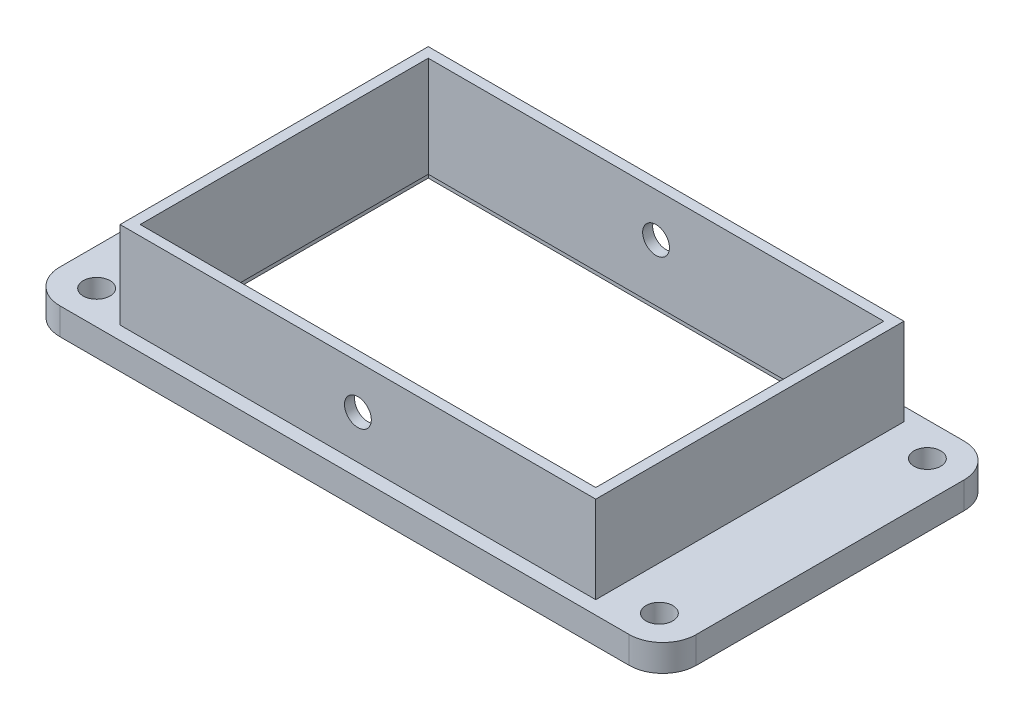
ISO-10303-21;
HEADER;
FILE_DESCRIPTION(('STEP AP214'),'2;1');
FILE_NAME('part.step','',(''),(''),'','','');
FILE_SCHEMA(('AUTOMOTIVE_DESIGN { 1 0 10303 214 1 1 1 1 }'));
ENDSEC;
DATA;
#1=APPLICATION_CONTEXT('core data for automotive mechanical design processes');
#2=APPLICATION_PROTOCOL_DEFINITION('international standard','automotive_design',2000,#1);
#3=PRODUCT_CONTEXT('',#1,'mechanical');
#4=PRODUCT('Part','Part','',(#3));
#5=PRODUCT_RELATED_PRODUCT_CATEGORY('part','',(#4));
#6=PRODUCT_DEFINITION_FORMATION('','',#4);
#7=PRODUCT_DEFINITION_CONTEXT('part definition',#1,'design');
#8=PRODUCT_DEFINITION('design','',#6,#7);
#9=PRODUCT_DEFINITION_SHAPE('','',#8);
#10=(LENGTH_UNIT() NAMED_UNIT(*) SI_UNIT(.MILLI.,.METRE.));
#11=(NAMED_UNIT(*) PLANE_ANGLE_UNIT() SI_UNIT($,.RADIAN.));
#12=(NAMED_UNIT(*) SI_UNIT($,.STERADIAN.) SOLID_ANGLE_UNIT());
#13=UNCERTAINTY_MEASURE_WITH_UNIT(LENGTH_MEASURE(1.E-05),#10,'distance_accuracy_value','');
#14=(GEOMETRIC_REPRESENTATION_CONTEXT(3) GLOBAL_UNCERTAINTY_ASSIGNED_CONTEXT((#13)) GLOBAL_UNIT_ASSIGNED_CONTEXT((#10,
#11,#12)) REPRESENTATION_CONTEXT('',''));
#15=CARTESIAN_POINT('',(0.,0.,0.));
#16=DIRECTION('',(0.,0.,1.));
#17=DIRECTION('',(1.,0.,0.));
#18=AXIS2_PLACEMENT_3D('',#15,#16,#17);
#19=CARTESIAN_POINT('',(0.,15.,0.));
#20=DIRECTION('',(0.,-1.,0.));
#21=DIRECTION('',(0.,0.,-1.));
#22=AXIS2_PLACEMENT_3D('',#19,#20,#21);
#23=PLANE('',#22);
#24=DIRECTION('',(0.,0.,1.));
#25=VECTOR('',#24,1.);
#26=CARTESIAN_POINT('',(-1.5,15.,1.5));
#27=LINE('',#26,#25);
#28=CARTESIAN_POINT('',(-1.5,15.,-44.5));
#29=VERTEX_POINT('',#28);
#30=CARTESIAN_POINT('',(-1.5,15.,1.5));
#31=VERTEX_POINT('',#30);
#32=EDGE_CURVE('E326',#29,#31,#27,.T.);
#33=ORIENTED_EDGE('',*,*,#32,.T.);
#34=DIRECTION('',(1.,0.,0.));
#35=VECTOR('',#34,1.);
#36=CARTESIAN_POINT('',(-1.5,15.,1.5));
#37=LINE('',#36,#35);
#38=CARTESIAN_POINT('',(69.5,15.,1.5));
#39=VERTEX_POINT('',#38);
#40=EDGE_CURVE('E329',#31,#39,#37,.T.);
#41=ORIENTED_EDGE('',*,*,#40,.T.);
#42=DIRECTION('',(0.,0.,-1.));
#43=VECTOR('',#42,1.);
#44=CARTESIAN_POINT('',(69.5,15.,1.5));
#45=LINE('',#44,#43);
#46=CARTESIAN_POINT('',(69.5,15.,-44.5));
#47=VERTEX_POINT('',#46);
#48=EDGE_CURVE('E331',#39,#47,#45,.T.);
#49=ORIENTED_EDGE('',*,*,#48,.T.);
#50=DIRECTION('',(-1.,0.,0.));
#51=VECTOR('',#50,1.);
#52=CARTESIAN_POINT('',(-1.5,15.,-44.5));
#53=LINE('',#52,#51);
#54=EDGE_CURVE('E333',#47,#29,#53,.T.);
#55=ORIENTED_EDGE('',*,*,#54,.T.);
#56=EDGE_LOOP('',(#33,#41,#49,#55));
#57=FACE_BOUND('',#56,.T.);
#58=DIRECTION('',(0.,0.,1.));
#59=VECTOR('',#58,1.);
#60=CARTESIAN_POINT('',(0.,15.,0.));
#61=LINE('',#60,#59);
#62=CARTESIAN_POINT('',(0.,15.,-43.));
#63=VERTEX_POINT('',#62);
#64=CARTESIAN_POINT('',(0.,15.,0.));
#65=VERTEX_POINT('',#64);
#66=EDGE_CURVE('E296',#63,#65,#61,.T.);
#67=ORIENTED_EDGE('',*,*,#66,.F.);
#68=DIRECTION('',(-1.,0.,0.));
#69=VECTOR('',#68,1.);
#70=CARTESIAN_POINT('',(0.,15.,-43.));
#71=LINE('',#70,#69);
#72=CARTESIAN_POINT('',(68.,15.,-43.));
#73=VERTEX_POINT('',#72);
#74=EDGE_CURVE('E304',#73,#63,#71,.T.);
#75=ORIENTED_EDGE('',*,*,#74,.F.);
#76=DIRECTION('',(0.,0.,-1.));
#77=VECTOR('',#76,1.);
#78=CARTESIAN_POINT('',(68.,15.,0.));
#79=LINE('',#78,#77);
#80=CARTESIAN_POINT('',(68.,15.,0.));
#81=VERTEX_POINT('',#80);
#82=EDGE_CURVE('E301',#81,#73,#79,.T.);
#83=ORIENTED_EDGE('',*,*,#82,.F.);
#84=DIRECTION('',(1.,0.,0.));
#85=VECTOR('',#84,1.);
#86=CARTESIAN_POINT('',(0.,15.,0.));
#87=LINE('',#86,#85);
#88=EDGE_CURVE('E298',#65,#81,#87,.T.);
#89=ORIENTED_EDGE('',*,*,#88,.F.);
#90=EDGE_LOOP('',(#67,#75,#83,#89));
#91=FACE_BOUND('',#90,.T.);
#92=ADVANCED_FACE('F35',(#57,#91),#23,.F.);
#93=CARTESIAN_POINT('',(0.,0.,0.));
#94=DIRECTION('',(0.,-1.,0.));
#95=DIRECTION('',(0.,0.,-1.));
#96=AXIS2_PLACEMENT_3D('',#93,#94,#95);
#97=PLANE('',#96);
#98=DIRECTION('',(0.,0.,1.));
#99=VECTOR('',#98,1.);
#100=CARTESIAN_POINT('',(69.5,0.,-44.5));
#101=LINE('',#100,#99);
#102=CARTESIAN_POINT('',(69.5,0.,-44.5));
#103=VERTEX_POINT('',#102);
#104=CARTESIAN_POINT('',(69.5,0.,1.50000000000001));
#105=VERTEX_POINT('',#104);
#106=EDGE_CURVE('E51',#103,#105,#101,.T.);
#107=ORIENTED_EDGE('',*,*,#106,.T.);
#108=DIRECTION('',(-1.,0.,0.));
#109=VECTOR('',#108,1.);
#110=CARTESIAN_POINT('',(69.5,0.,1.50000000000001));
#111=LINE('',#110,#109);
#112=CARTESIAN_POINT('',(-1.5,0.,1.5));
#113=VERTEX_POINT('',#112);
#114=EDGE_CURVE('E55',#105,#113,#111,.T.);
#115=ORIENTED_EDGE('',*,*,#114,.T.);
#116=DIRECTION('',(0.,0.,-1.));
#117=VECTOR('',#116,1.);
#118=CARTESIAN_POINT('',(-1.5,0.,-44.5));
#119=LINE('',#118,#117);
#120=CARTESIAN_POINT('',(-1.5,0.,-44.5));
#121=VERTEX_POINT('',#120);
#122=EDGE_CURVE('E204',#113,#121,#119,.T.);
#123=ORIENTED_EDGE('',*,*,#122,.T.);
#124=DIRECTION('',(1.,0.,0.));
#125=VECTOR('',#124,1.);
#126=CARTESIAN_POINT('',(69.5,0.,-44.5));
#127=LINE('',#126,#125);
#128=EDGE_CURVE('E182',#121,#103,#127,.T.);
#129=ORIENTED_EDGE('',*,*,#128,.T.);
#130=EDGE_LOOP('',(#107,#115,#123,#129));
#131=FACE_BOUND('',#130,.T.);
#132=DIRECTION('',(-1.,0.,0.));
#133=VECTOR('',#132,1.);
#134=CARTESIAN_POINT('',(0.,0.,-43.));
#135=LINE('',#134,#133);
#136=CARTESIAN_POINT('',(68.,0.,-43.));
#137=VERTEX_POINT('',#136);
#138=CARTESIAN_POINT('',(0.,0.,-43.));
#139=VERTEX_POINT('',#138);
#140=EDGE_CURVE('E299',#137,#139,#135,.T.);
#141=ORIENTED_EDGE('',*,*,#140,.T.);
#142=DIRECTION('',(0.,0.,1.));
#143=VECTOR('',#142,1.);
#144=CARTESIAN_POINT('',(0.,0.,0.));
#145=LINE('',#144,#143);
#146=CARTESIAN_POINT('',(0.,0.,0.));
#147=VERTEX_POINT('',#146);
#148=EDGE_CURVE('E282',#139,#147,#145,.T.);
#149=ORIENTED_EDGE('',*,*,#148,.T.);
#150=DIRECTION('',(1.,0.,0.));
#151=VECTOR('',#150,1.);
#152=CARTESIAN_POINT('',(0.,0.,0.));
#153=LINE('',#152,#151);
#154=CARTESIAN_POINT('',(68.,0.,0.));
#155=VERTEX_POINT('',#154);
#156=EDGE_CURVE('E309',#147,#155,#153,.T.);
#157=ORIENTED_EDGE('',*,*,#156,.T.);
#158=DIRECTION('',(0.,0.,-1.));
#159=VECTOR('',#158,1.);
#160=CARTESIAN_POINT('',(68.,0.,0.));
#161=LINE('',#160,#159);
#162=EDGE_CURVE('E312',#155,#137,#161,.T.);
#163=ORIENTED_EDGE('',*,*,#162,.T.);
#164=EDGE_LOOP('',(#141,#149,#157,#163));
#165=FACE_BOUND('',#164,.T.);
#166=ADVANCED_FACE('F366',(#131,#165),#97,.T.);
#167=CARTESIAN_POINT('',(-1.5,15.,1.5));
#168=DIRECTION('',(1.,0.,0.));
#169=DIRECTION('',(0.,0.,-1.));
#170=AXIS2_PLACEMENT_3D('',#167,#168,#169);
#171=PLANE('',#170);
#172=DIRECTION('',(0.,-1.,0.));
#173=VECTOR('',#172,1.);
#174=CARTESIAN_POINT('',(-1.5,15.,-44.5));
#175=LINE('',#174,#173);
#176=CARTESIAN_POINT('',(-1.5,2.,-44.5));
#177=VERTEX_POINT('',#176);
#178=EDGE_CURVE('E335',#29,#177,#175,.T.);
#179=ORIENTED_EDGE('',*,*,#178,.T.);
#180=DIRECTION('',(0.,0.,-1.));
#181=VECTOR('',#180,1.);
#182=CARTESIAN_POINT('',(-1.5,2.,-44.5));
#183=LINE('',#182,#181);
#184=CARTESIAN_POINT('',(-1.5,2.,1.5));
#185=VERTEX_POINT('',#184);
#186=EDGE_CURVE('E251',#185,#177,#183,.T.);
#187=ORIENTED_EDGE('',*,*,#186,.F.);
#188=DIRECTION('',(0.,-1.,0.));
#189=VECTOR('',#188,1.);
#190=CARTESIAN_POINT('',(-1.5,15.,1.5));
#191=LINE('',#190,#189);
#192=EDGE_CURVE('E11',#31,#185,#191,.T.);
#193=ORIENTED_EDGE('',*,*,#192,.F.);
#194=ORIENTED_EDGE('',*,*,#32,.F.);
#195=EDGE_LOOP('',(#179,#187,#193,#194));
#196=FACE_BOUND('',#195,.T.);
#197=ADVANCED_FACE('F37',(#196),#171,.F.);
#198=CARTESIAN_POINT('',(-1.5,15.,1.5));
#199=DIRECTION('',(0.,0.,-1.));
#200=DIRECTION('',(-1.,0.,0.));
#201=AXIS2_PLACEMENT_3D('',#198,#199,#200);
#202=PLANE('',#201);
#203=CARTESIAN_POINT('',(34.,8.5,1.5));
#204=DIRECTION('',(0.,0.,1.));
#205=DIRECTION('',(1.,0.,0.));
#206=AXIS2_PLACEMENT_3D('',#203,#204,#205);
#207=CIRCLE('',#206,2.);
#208=CARTESIAN_POINT('',(36.,8.5,1.5));
#209=VERTEX_POINT('',#208);
#210=EDGE_CURVE('E417',#209,#209,#207,.T.);
#211=ORIENTED_EDGE('',*,*,#210,.F.);
#212=EDGE_LOOP('',(#211));
#213=FACE_BOUND('',#212,.T.);
#214=ORIENTED_EDGE('',*,*,#192,.T.);
#215=DIRECTION('',(-1.,0.,0.));
#216=VECTOR('',#215,1.);
#217=CARTESIAN_POINT('',(69.5,2.,1.50000000000001));
#218=LINE('',#217,#216);
#219=CARTESIAN_POINT('',(69.5,2.,1.50000000000001));
#220=VERTEX_POINT('',#219);
#221=EDGE_CURVE('E249',#220,#185,#218,.T.);
#222=ORIENTED_EDGE('',*,*,#221,.F.);
#223=DIRECTION('',(0.,-1.,0.));
#224=VECTOR('',#223,1.);
#225=CARTESIAN_POINT('',(69.5,15.,1.5));
#226=LINE('',#225,#224);
#227=EDGE_CURVE('E44',#39,#220,#226,.T.);
#228=ORIENTED_EDGE('',*,*,#227,.F.);
#229=ORIENTED_EDGE('',*,*,#40,.F.);
#230=EDGE_LOOP('',(#214,#222,#228,#229));
#231=FACE_BOUND('',#230,.T.);
#232=ADVANCED_FACE('F350',(#213,#231),#202,.F.);
#233=CARTESIAN_POINT('',(69.5,15.,1.5));
#234=DIRECTION('',(-1.,0.,0.));
#235=DIRECTION('',(0.,0.,1.));
#236=AXIS2_PLACEMENT_3D('',#233,#234,#235);
#237=PLANE('',#236);
#238=ORIENTED_EDGE('',*,*,#227,.T.);
#239=DIRECTION('',(0.,0.,1.));
#240=VECTOR('',#239,1.);
#241=CARTESIAN_POINT('',(69.5,2.,-44.5));
#242=LINE('',#241,#240);
#243=CARTESIAN_POINT('',(69.5,2.,-44.5));
#244=VERTEX_POINT('',#243);
#245=EDGE_CURVE('E247',#244,#220,#242,.T.);
#246=ORIENTED_EDGE('',*,*,#245,.F.);
#247=DIRECTION('',(0.,-1.,0.));
#248=VECTOR('',#247,1.);
#249=CARTESIAN_POINT('',(69.5,15.,-44.5));
#250=LINE('',#249,#248);
#251=EDGE_CURVE('E338',#47,#244,#250,.T.);
#252=ORIENTED_EDGE('',*,*,#251,.F.);
#253=ORIENTED_EDGE('',*,*,#48,.F.);
#254=EDGE_LOOP('',(#238,#246,#252,#253));
#255=FACE_BOUND('',#254,.T.);
#256=ADVANCED_FACE('F346',(#255),#237,.F.);
#257=CARTESIAN_POINT('',(-1.5,15.,-44.5));
#258=DIRECTION('',(0.,0.,1.));
#259=DIRECTION('',(1.,0.,0.));
#260=AXIS2_PLACEMENT_3D('',#257,#258,#259);
#261=PLANE('',#260);
#262=CARTESIAN_POINT('',(34.,8.5,-44.5));
#263=DIRECTION('',(0.,0.,1.));
#264=DIRECTION('',(1.,0.,0.));
#265=AXIS2_PLACEMENT_3D('',#262,#263,#264);
#266=CIRCLE('',#265,2.);
#267=CARTESIAN_POINT('',(36.,8.5,-44.5));
#268=VERTEX_POINT('',#267);
#269=EDGE_CURVE('E425',#268,#268,#266,.T.);
#270=ORIENTED_EDGE('',*,*,#269,.T.);
#271=EDGE_LOOP('',(#270));
#272=FACE_BOUND('',#271,.T.);
#273=ORIENTED_EDGE('',*,*,#251,.T.);
#274=DIRECTION('',(1.,0.,0.));
#275=VECTOR('',#274,1.);
#276=CARTESIAN_POINT('',(69.5,2.,-44.5));
#277=LINE('',#276,#275);
#278=EDGE_CURVE('E253',#177,#244,#277,.T.);
#279=ORIENTED_EDGE('',*,*,#278,.F.);
#280=ORIENTED_EDGE('',*,*,#178,.F.);
#281=ORIENTED_EDGE('',*,*,#54,.F.);
#282=EDGE_LOOP('',(#273,#279,#280,#281));
#283=FACE_BOUND('',#282,.T.);
#284=ADVANCED_FACE('F362',(#272,#283),#261,.F.);
#285=CARTESIAN_POINT('',(0.,15.,0.));
#286=DIRECTION('',(1.,0.,0.));
#287=DIRECTION('',(0.,0.,-1.));
#288=AXIS2_PLACEMENT_3D('',#285,#286,#287);
#289=PLANE('',#288);
#290=ORIENTED_EDGE('',*,*,#148,.F.);
#291=DIRECTION('',(0.,-1.,0.));
#292=VECTOR('',#291,1.);
#293=CARTESIAN_POINT('',(0.,15.,-43.));
#294=LINE('',#293,#292);
#295=EDGE_CURVE('E306',#63,#139,#294,.T.);
#296=ORIENTED_EDGE('',*,*,#295,.F.);
#297=ORIENTED_EDGE('',*,*,#66,.T.);
#298=DIRECTION('',(0.,-1.,0.));
#299=VECTOR('',#298,1.);
#300=CARTESIAN_POINT('',(0.,15.,0.));
#301=LINE('',#300,#299);
#302=EDGE_CURVE('E323',#65,#147,#301,.T.);
#303=ORIENTED_EDGE('',*,*,#302,.T.);
#304=EDGE_LOOP('',(#290,#296,#297,#303));
#305=FACE_BOUND('',#304,.T.);
#306=ADVANCED_FACE('F375',(#305),#289,.T.);
#307=CARTESIAN_POINT('',(0.,15.,0.));
#308=DIRECTION('',(0.,0.,-1.));
#309=DIRECTION('',(-1.,0.,0.));
#310=AXIS2_PLACEMENT_3D('',#307,#308,#309);
#311=PLANE('',#310);
#312=CARTESIAN_POINT('',(34.,8.5,0.));
#313=DIRECTION('',(0.,0.,-1.));
#314=DIRECTION('',(-1.,0.,0.));
#315=AXIS2_PLACEMENT_3D('',#312,#313,#314);
#316=CIRCLE('',#315,2.);
#317=CARTESIAN_POINT('',(32.,8.5,0.));
#318=VERTEX_POINT('',#317);
#319=EDGE_CURVE('E421',#318,#318,#316,.T.);
#320=ORIENTED_EDGE('',*,*,#319,.F.);
#321=EDGE_LOOP('',(#320));
#322=FACE_BOUND('',#321,.T.);
#323=ORIENTED_EDGE('',*,*,#156,.F.);
#324=ORIENTED_EDGE('',*,*,#302,.F.);
#325=ORIENTED_EDGE('',*,*,#88,.T.);
#326=DIRECTION('',(0.,-1.,0.));
#327=VECTOR('',#326,1.);
#328=CARTESIAN_POINT('',(68.,15.,0.));
#329=LINE('',#328,#327);
#330=EDGE_CURVE('E321',#81,#155,#329,.T.);
#331=ORIENTED_EDGE('',*,*,#330,.T.);
#332=EDGE_LOOP('',(#323,#324,#325,#331));
#333=FACE_BOUND('',#332,.T.);
#334=ADVANCED_FACE('F377',(#322,#333),#311,.T.);
#335=CARTESIAN_POINT('',(68.,15.,0.));
#336=DIRECTION('',(-1.,0.,0.));
#337=DIRECTION('',(0.,0.,1.));
#338=AXIS2_PLACEMENT_3D('',#335,#336,#337);
#339=PLANE('',#338);
#340=ORIENTED_EDGE('',*,*,#162,.F.);
#341=ORIENTED_EDGE('',*,*,#330,.F.);
#342=ORIENTED_EDGE('',*,*,#82,.T.);
#343=DIRECTION('',(0.,-1.,0.));
#344=VECTOR('',#343,1.);
#345=CARTESIAN_POINT('',(68.,15.,-43.));
#346=LINE('',#345,#344);
#347=EDGE_CURVE('E319',#73,#137,#346,.T.);
#348=ORIENTED_EDGE('',*,*,#347,.T.);
#349=EDGE_LOOP('',(#340,#341,#342,#348));
#350=FACE_BOUND('',#349,.T.);
#351=ADVANCED_FACE('F385',(#350),#339,.T.);
#352=CARTESIAN_POINT('',(0.,15.,-43.));
#353=DIRECTION('',(0.,0.,1.));
#354=DIRECTION('',(1.,0.,0.));
#355=AXIS2_PLACEMENT_3D('',#352,#353,#354);
#356=PLANE('',#355);
#357=CARTESIAN_POINT('',(34.,8.5,-43.));
#358=DIRECTION('',(0.,0.,1.));
#359=DIRECTION('',(1.,0.,0.));
#360=AXIS2_PLACEMENT_3D('',#357,#358,#359);
#361=CIRCLE('',#360,2.);
#362=CARTESIAN_POINT('',(36.,8.5,-43.));
#363=VERTEX_POINT('',#362);
#364=EDGE_CURVE('E39',#363,#363,#361,.T.);
#365=ORIENTED_EDGE('',*,*,#364,.F.);
#366=EDGE_LOOP('',(#365));
#367=FACE_BOUND('',#366,.T.);
#368=ORIENTED_EDGE('',*,*,#140,.F.);
#369=ORIENTED_EDGE('',*,*,#347,.F.);
#370=ORIENTED_EDGE('',*,*,#74,.T.);
#371=ORIENTED_EDGE('',*,*,#295,.T.);
#372=EDGE_LOOP('',(#368,#369,#370,#371));
#373=FACE_BOUND('',#372,.T.);
#374=ADVANCED_FACE('F383',(#367,#373),#356,.T.);
#375=CARTESIAN_POINT('',(-8.5,2.,-41.5));
#376=DIRECTION('',(0.,-1.,0.));
#377=DIRECTION('',(0.,0.,-1.));
#378=AXIS2_PLACEMENT_3D('',#375,#376,#377);
#379=CYLINDRICAL_SURFACE('',#378,5.);
#380=DIRECTION('',(0.,-1.,0.));
#381=VECTOR('',#380,1.);
#382=CARTESIAN_POINT('',(-8.5,2.,-46.5));
#383=LINE('',#382,#381);
#384=CARTESIAN_POINT('',(-8.5,2.,-46.5));
#385=VERTEX_POINT('',#384);
#386=CARTESIAN_POINT('',(-8.5,-2.,-46.5));
#387=VERTEX_POINT('',#386);
#388=EDGE_CURVE('E279',#385,#387,#383,.T.);
#389=ORIENTED_EDGE('',*,*,#388,.T.);
#390=CARTESIAN_POINT('',(-8.5,-2.,-41.5));
#391=DIRECTION('',(0.,-1.,0.));
#392=DIRECTION('',(0.,0.,1.));
#393=AXIS2_PLACEMENT_3D('',#390,#391,#392);
#394=CIRCLE('',#393,5.);
#395=CARTESIAN_POINT('',(-13.5,-2.,-41.5));
#396=VERTEX_POINT('',#395);
#397=EDGE_CURVE('E187',#396,#387,#394,.T.);
#398=ORIENTED_EDGE('',*,*,#397,.F.);
#399=DIRECTION('',(0.,-1.,0.));
#400=VECTOR('',#399,1.);
#401=CARTESIAN_POINT('',(-13.5,2.,-41.5));
#402=LINE('',#401,#400);
#403=CARTESIAN_POINT('',(-13.5,2.,-41.5));
#404=VERTEX_POINT('',#403);
#405=EDGE_CURVE('E280',#404,#396,#402,.T.);
#406=ORIENTED_EDGE('',*,*,#405,.F.);
#407=CARTESIAN_POINT('',(-8.5,2.,-41.5));
#408=DIRECTION('',(0.,-1.,0.));
#409=DIRECTION('',(0.,0.,1.));
#410=AXIS2_PLACEMENT_3D('',#407,#408,#409);
#411=CIRCLE('',#410,5.);
#412=EDGE_CURVE('E255',#404,#385,#411,.T.);
#413=ORIENTED_EDGE('',*,*,#412,.T.);
#414=EDGE_LOOP('',(#389,#398,#406,#413));
#415=FACE_BOUND('',#414,.T.);
#416=ADVANCED_FACE('F393',(#415),#379,.T.);
#417=CARTESIAN_POINT('',(-13.5,2.,-41.5));
#418=DIRECTION('',(-1.,0.,0.));
#419=DIRECTION('',(0.,0.,1.));
#420=AXIS2_PLACEMENT_3D('',#417,#418,#419);
#421=PLANE('',#420);
#422=ORIENTED_EDGE('',*,*,#405,.T.);
#423=DIRECTION('',(0.,0.,-1.));
#424=VECTOR('',#423,1.);
#425=CARTESIAN_POINT('',(-13.5,-2.,-41.5));
#426=LINE('',#425,#424);
#427=CARTESIAN_POINT('',(-13.5,-2.,-1.5));
#428=VERTEX_POINT('',#427);
#429=EDGE_CURVE('E232',#428,#396,#426,.T.);
#430=ORIENTED_EDGE('',*,*,#429,.F.);
#431=DIRECTION('',(0.,-1.,0.));
#432=VECTOR('',#431,1.);
#433=CARTESIAN_POINT('',(-13.5,2.,-1.5));
#434=LINE('',#433,#432);
#435=CARTESIAN_POINT('',(-13.5,2.,-1.5));
#436=VERTEX_POINT('',#435);
#437=EDGE_CURVE('E283',#436,#428,#434,.T.);
#438=ORIENTED_EDGE('',*,*,#437,.F.);
#439=DIRECTION('',(0.,0.,-1.));
#440=VECTOR('',#439,1.);
#441=CARTESIAN_POINT('',(-13.5,2.,-41.5));
#442=LINE('',#441,#440);
#443=EDGE_CURVE('E276',#436,#404,#442,.T.);
#444=ORIENTED_EDGE('',*,*,#443,.T.);
#445=EDGE_LOOP('',(#422,#430,#438,#444));
#446=FACE_BOUND('',#445,.T.);
#447=ADVANCED_FACE('F474',(#446),#421,.T.);
#448=CARTESIAN_POINT('',(-8.50000000000001,2.,-1.5));
#449=DIRECTION('',(0.,-1.,0.));
#450=DIRECTION('',(0.,0.,-1.));
#451=AXIS2_PLACEMENT_3D('',#448,#449,#450);
#452=CYLINDRICAL_SURFACE('',#451,5.);
#453=ORIENTED_EDGE('',*,*,#437,.T.);
#454=CARTESIAN_POINT('',(-8.50000000000001,-2.,-1.5));
#455=DIRECTION('',(0.,-1.,0.));
#456=DIRECTION('',(0.,0.,-1.));
#457=AXIS2_PLACEMENT_3D('',#454,#455,#456);
#458=CIRCLE('',#457,5.);
#459=CARTESIAN_POINT('',(-8.50000000000001,-2.,3.5));
#460=VERTEX_POINT('',#459);
#461=EDGE_CURVE('E229',#460,#428,#458,.T.);
#462=ORIENTED_EDGE('',*,*,#461,.F.);
#463=DIRECTION('',(0.,-1.,0.));
#464=VECTOR('',#463,1.);
#465=CARTESIAN_POINT('',(-8.50000000000001,2.,3.5));
#466=LINE('',#465,#464);
#467=CARTESIAN_POINT('',(-8.50000000000001,2.,3.5));
#468=VERTEX_POINT('',#467);
#469=EDGE_CURVE('E285',#468,#460,#466,.T.);
#470=ORIENTED_EDGE('',*,*,#469,.F.);
#471=CARTESIAN_POINT('',(-8.50000000000001,2.,-1.5));
#472=DIRECTION('',(0.,-1.,0.));
#473=DIRECTION('',(0.,0.,-1.));
#474=AXIS2_PLACEMENT_3D('',#471,#472,#473);
#475=CIRCLE('',#474,5.);
#476=EDGE_CURVE('E273',#468,#436,#475,.T.);
#477=ORIENTED_EDGE('',*,*,#476,.T.);
#478=EDGE_LOOP('',(#453,#462,#470,#477));
#479=FACE_BOUND('',#478,.T.);
#480=ADVANCED_FACE('F477',(#479),#452,.T.);
#481=CARTESIAN_POINT('',(76.5,2.,3.50000000000001));
#482=DIRECTION('',(0.,0.,1.));
#483=DIRECTION('',(1.,0.,0.));
#484=AXIS2_PLACEMENT_3D('',#481,#482,#483);
#485=PLANE('',#484);
#486=ORIENTED_EDGE('',*,*,#469,.T.);
#487=DIRECTION('',(-1.,0.,0.));
#488=VECTOR('',#487,1.);
#489=CARTESIAN_POINT('',(76.5,-2.,3.50000000000001));
#490=LINE('',#489,#488);
#491=CARTESIAN_POINT('',(76.5,-2.,3.50000000000001));
#492=VERTEX_POINT('',#491);
#493=EDGE_CURVE('E226',#492,#460,#490,.T.);
#494=ORIENTED_EDGE('',*,*,#493,.F.);
#495=DIRECTION('',(0.,-1.,0.));
#496=VECTOR('',#495,1.);
#497=CARTESIAN_POINT('',(76.5,2.,3.50000000000001));
#498=LINE('',#497,#496);
#499=CARTESIAN_POINT('',(76.5,2.,3.50000000000001));
#500=VERTEX_POINT('',#499);
#501=EDGE_CURVE('E287',#500,#492,#498,.T.);
#502=ORIENTED_EDGE('',*,*,#501,.F.);
#503=DIRECTION('',(-1.,0.,0.));
#504=VECTOR('',#503,1.);
#505=CARTESIAN_POINT('',(76.5,2.,3.50000000000001));
#506=LINE('',#505,#504);
#507=EDGE_CURVE('E270',#500,#468,#506,.T.);
#508=ORIENTED_EDGE('',*,*,#507,.T.);
#509=EDGE_LOOP('',(#486,#494,#502,#508));
#510=FACE_BOUND('',#509,.T.);
#511=ADVANCED_FACE('F481',(#510),#485,.T.);
#512=CARTESIAN_POINT('',(76.5,2.,-1.49999999999999));
#513=DIRECTION('',(0.,-1.,0.));
#514=DIRECTION('',(0.,0.,-1.));
#515=AXIS2_PLACEMENT_3D('',#512,#513,#514);
#516=CYLINDRICAL_SURFACE('',#515,5.);
#517=ORIENTED_EDGE('',*,*,#501,.T.);
#518=CARTESIAN_POINT('',(76.5,-2.,-1.49999999999999));
#519=DIRECTION('',(0.,-1.,0.));
#520=DIRECTION('',(0.,0.,-1.));
#521=AXIS2_PLACEMENT_3D('',#518,#519,#520);
#522=CIRCLE('',#521,5.);
#523=CARTESIAN_POINT('',(81.5,-2.,-1.49999999999999));
#524=VERTEX_POINT('',#523);
#525=EDGE_CURVE('E223',#524,#492,#522,.T.);
#526=ORIENTED_EDGE('',*,*,#525,.F.);
#527=DIRECTION('',(0.,-1.,0.));
#528=VECTOR('',#527,1.);
#529=CARTESIAN_POINT('',(81.5,2.,-1.49999999999999));
#530=LINE('',#529,#528);
#531=CARTESIAN_POINT('',(81.5,2.,-1.49999999999999));
#532=VERTEX_POINT('',#531);
#533=EDGE_CURVE('E289',#532,#524,#530,.T.);
#534=ORIENTED_EDGE('',*,*,#533,.F.);
#535=CARTESIAN_POINT('',(76.5,2.,-1.49999999999999));
#536=DIRECTION('',(0.,-1.,0.));
#537=DIRECTION('',(0.,0.,-1.));
#538=AXIS2_PLACEMENT_3D('',#535,#536,#537);
#539=CIRCLE('',#538,5.);
#540=EDGE_CURVE('E267',#532,#500,#539,.T.);
#541=ORIENTED_EDGE('',*,*,#540,.T.);
#542=EDGE_LOOP('',(#517,#526,#534,#541));
#543=FACE_BOUND('',#542,.T.);
#544=ADVANCED_FACE('F485',(#543),#516,.T.);
#545=CARTESIAN_POINT('',(81.5,2.,-41.5));
#546=DIRECTION('',(1.,0.,0.));
#547=DIRECTION('',(0.,0.,-1.));
#548=AXIS2_PLACEMENT_3D('',#545,#546,#547);
#549=PLANE('',#548);
#550=ORIENTED_EDGE('',*,*,#533,.T.);
#551=DIRECTION('',(0.,0.,1.));
#552=VECTOR('',#551,1.);
#553=CARTESIAN_POINT('',(81.5,-2.,-41.5));
#554=LINE('',#553,#552);
#555=CARTESIAN_POINT('',(81.5,-2.,-41.5));
#556=VERTEX_POINT('',#555);
#557=EDGE_CURVE('E220',#556,#524,#554,.T.);
#558=ORIENTED_EDGE('',*,*,#557,.F.);
#559=DIRECTION('',(0.,-1.,0.));
#560=VECTOR('',#559,1.);
#561=CARTESIAN_POINT('',(81.5,2.,-41.5));
#562=LINE('',#561,#560);
#563=CARTESIAN_POINT('',(81.5,2.,-41.5));
#564=VERTEX_POINT('',#563);
#565=EDGE_CURVE('E291',#564,#556,#562,.T.);
#566=ORIENTED_EDGE('',*,*,#565,.F.);
#567=DIRECTION('',(0.,0.,1.));
#568=VECTOR('',#567,1.);
#569=CARTESIAN_POINT('',(81.5,2.,-41.5));
#570=LINE('',#569,#568);
#571=EDGE_CURVE('E264',#564,#532,#570,.T.);
#572=ORIENTED_EDGE('',*,*,#571,.T.);
#573=EDGE_LOOP('',(#550,#558,#566,#572));
#574=FACE_BOUND('',#573,.T.);
#575=ADVANCED_FACE('F489',(#574),#549,.T.);
#576=CARTESIAN_POINT('',(76.5,2.,-41.5));
#577=DIRECTION('',(0.,-1.,0.));
#578=DIRECTION('',(0.,0.,-1.));
#579=AXIS2_PLACEMENT_3D('',#576,#577,#578);
#580=CYLINDRICAL_SURFACE('',#579,5.);
#581=ORIENTED_EDGE('',*,*,#565,.T.);
#582=CARTESIAN_POINT('',(76.5,-2.,-41.5));
#583=DIRECTION('',(0.,-1.,0.));
#584=DIRECTION('',(0.,0.,-1.));
#585=AXIS2_PLACEMENT_3D('',#582,#583,#584);
#586=CIRCLE('',#585,5.);
#587=CARTESIAN_POINT('',(76.5,-2.,-46.5));
#588=VERTEX_POINT('',#587);
#589=EDGE_CURVE('E217',#588,#556,#586,.T.);
#590=ORIENTED_EDGE('',*,*,#589,.F.);
#591=DIRECTION('',(0.,-1.,0.));
#592=VECTOR('',#591,1.);
#593=CARTESIAN_POINT('',(76.5,2.,-46.5));
#594=LINE('',#593,#592);
#595=CARTESIAN_POINT('',(76.5,2.,-46.5));
#596=VERTEX_POINT('',#595);
#597=EDGE_CURVE('E293',#596,#588,#594,.T.);
#598=ORIENTED_EDGE('',*,*,#597,.F.);
#599=CARTESIAN_POINT('',(76.5,2.,-41.5));
#600=DIRECTION('',(0.,-1.,0.));
#601=DIRECTION('',(0.,0.,-1.));
#602=AXIS2_PLACEMENT_3D('',#599,#600,#601);
#603=CIRCLE('',#602,5.);
#604=EDGE_CURVE('E261',#596,#564,#603,.T.);
#605=ORIENTED_EDGE('',*,*,#604,.T.);
#606=EDGE_LOOP('',(#581,#590,#598,#605));
#607=FACE_BOUND('',#606,.T.);
#608=ADVANCED_FACE('F493',(#607),#580,.T.);
#609=CARTESIAN_POINT('',(76.5,2.,-46.5));
#610=DIRECTION('',(0.,0.,-1.));
#611=DIRECTION('',(-1.,0.,0.));
#612=AXIS2_PLACEMENT_3D('',#609,#610,#611);
#613=PLANE('',#612);
#614=ORIENTED_EDGE('',*,*,#597,.T.);
#615=DIRECTION('',(1.,0.,0.));
#616=VECTOR('',#615,1.);
#617=CARTESIAN_POINT('',(76.5,-2.,-46.5));
#618=LINE('',#617,#616);
#619=EDGE_CURVE('E214',#387,#588,#618,.T.);
#620=ORIENTED_EDGE('',*,*,#619,.F.);
#621=ORIENTED_EDGE('',*,*,#388,.F.);
#622=DIRECTION('',(1.,0.,0.));
#623=VECTOR('',#622,1.);
#624=CARTESIAN_POINT('',(76.5,2.,-46.5));
#625=LINE('',#624,#623);
#626=EDGE_CURVE('E258',#385,#596,#625,.T.);
#627=ORIENTED_EDGE('',*,*,#626,.T.);
#628=EDGE_LOOP('',(#614,#620,#621,#627));
#629=FACE_BOUND('',#628,.T.);
#630=ADVANCED_FACE('F472',(#629),#613,.T.);
#631=CARTESIAN_POINT('',(-8.5,2.,-41.5));
#632=DIRECTION('',(0.,1.,0.));
#633=DIRECTION('',(0.,0.,1.));
#634=AXIS2_PLACEMENT_3D('',#631,#632,#633);
#635=PLANE('',#634);
#636=CARTESIAN_POINT('',(-8.00000000000001,2.,-41.5));
#637=DIRECTION('',(0.,-1.,0.));
#638=DIRECTION('',(0.,0.,1.));
#639=AXIS2_PLACEMENT_3D('',#636,#637,#638);
#640=CIRCLE('',#639,2.);
#641=CARTESIAN_POINT('',(-8.00000000000001,2.,-39.5));
#642=VERTEX_POINT('',#641);
#643=EDGE_CURVE('E235',#642,#642,#640,.T.);
#644=ORIENTED_EDGE('',*,*,#643,.T.);
#645=EDGE_LOOP('',(#644));
#646=FACE_BOUND('',#645,.T.);
#647=CARTESIAN_POINT('',(-8.00000000000001,2.,-1.5));
#648=DIRECTION('',(0.,-1.,0.));
#649=DIRECTION('',(0.,0.,-1.));
#650=AXIS2_PLACEMENT_3D('',#647,#648,#649);
#651=CIRCLE('',#650,2.);
#652=CARTESIAN_POINT('',(-8.00000000000001,2.,-3.5));
#653=VERTEX_POINT('',#652);
#654=EDGE_CURVE('E238',#653,#653,#651,.T.);
#655=ORIENTED_EDGE('',*,*,#654,.T.);
#656=EDGE_LOOP('',(#655));
#657=FACE_BOUND('',#656,.T.);
#658=CARTESIAN_POINT('',(76.,2.,-1.5));
#659=DIRECTION('',(0.,-1.,0.));
#660=DIRECTION('',(0.,0.,1.));
#661=AXIS2_PLACEMENT_3D('',#658,#659,#660);
#662=CIRCLE('',#661,2.);
#663=CARTESIAN_POINT('',(76.,2.,0.499999999999995));
#664=VERTEX_POINT('',#663);
#665=EDGE_CURVE('E241',#664,#664,#662,.T.);
#666=ORIENTED_EDGE('',*,*,#665,.T.);
#667=EDGE_LOOP('',(#666));
#668=FACE_BOUND('',#667,.T.);
#669=CARTESIAN_POINT('',(76.,2.,-41.5));
#670=DIRECTION('',(0.,-1.,0.));
#671=DIRECTION('',(0.,0.,-1.));
#672=AXIS2_PLACEMENT_3D('',#669,#670,#671);
#673=CIRCLE('',#672,2.);
#674=CARTESIAN_POINT('',(76.,2.,-43.5));
#675=VERTEX_POINT('',#674);
#676=EDGE_CURVE('E244',#675,#675,#673,.T.);
#677=ORIENTED_EDGE('',*,*,#676,.T.);
#678=EDGE_LOOP('',(#677));
#679=FACE_BOUND('',#678,.T.);
#680=ORIENTED_EDGE('',*,*,#245,.T.);
#681=ORIENTED_EDGE('',*,*,#221,.T.);
#682=ORIENTED_EDGE('',*,*,#186,.T.);
#683=ORIENTED_EDGE('',*,*,#278,.T.);
#684=EDGE_LOOP('',(#680,#681,#682,#683));
#685=FACE_BOUND('',#684,.T.);
#686=ORIENTED_EDGE('',*,*,#412,.F.);
#687=ORIENTED_EDGE('',*,*,#443,.F.);
#688=ORIENTED_EDGE('',*,*,#476,.F.);
#689=ORIENTED_EDGE('',*,*,#507,.F.);
#690=ORIENTED_EDGE('',*,*,#540,.F.);
#691=ORIENTED_EDGE('',*,*,#571,.F.);
#692=ORIENTED_EDGE('',*,*,#604,.F.);
#693=ORIENTED_EDGE('',*,*,#626,.F.);
#694=EDGE_LOOP('',(#686,#687,#688,#689,#690,#691,#692,#693));
#695=FACE_BOUND('',#694,.T.);
#696=ADVANCED_FACE('F354',(#646,#657,#668,#679,#685,#695),#635,.T.);
#697=CARTESIAN_POINT('',(76.,2.,-41.5));
#698=DIRECTION('',(0.,-1.,0.));
#699=DIRECTION('',(0.,0.,-1.));
#700=AXIS2_PLACEMENT_3D('',#697,#698,#699);
#701=CYLINDRICAL_SURFACE('',#700,2.);
#702=ORIENTED_EDGE('',*,*,#676,.F.);
#703=EDGE_LOOP('',(#702));
#704=FACE_BOUND('',#703,.T.);
#705=CARTESIAN_POINT('',(76.,-2.,-41.5));
#706=DIRECTION('',(0.,-1.,0.));
#707=DIRECTION('',(0.,0.,-1.));
#708=AXIS2_PLACEMENT_3D('',#705,#706,#707);
#709=CIRCLE('',#708,2.);
#710=CARTESIAN_POINT('',(76.,-2.,-43.5));
#711=VERTEX_POINT('',#710);
#712=EDGE_CURVE('E202',#711,#711,#709,.T.);
#713=ORIENTED_EDGE('',*,*,#712,.T.);
#714=EDGE_LOOP('',(#713));
#715=FACE_BOUND('',#714,.T.);
#716=ADVANCED_FACE('F439',(#704,#715),#701,.F.);
#717=CARTESIAN_POINT('',(76.,2.,-1.5));
#718=DIRECTION('',(0.,-1.,0.));
#719=DIRECTION('',(0.,0.,-1.));
#720=AXIS2_PLACEMENT_3D('',#717,#718,#719);
#721=CYLINDRICAL_SURFACE('',#720,2.);
#722=ORIENTED_EDGE('',*,*,#665,.F.);
#723=EDGE_LOOP('',(#722));
#724=FACE_BOUND('',#723,.T.);
#725=CARTESIAN_POINT('',(76.,-2.,-1.5));
#726=DIRECTION('',(0.,-1.,0.));
#727=DIRECTION('',(0.,0.,1.));
#728=AXIS2_PLACEMENT_3D('',#725,#726,#727);
#729=CIRCLE('',#728,2.);
#730=CARTESIAN_POINT('',(76.,-2.,0.499999999999995));
#731=VERTEX_POINT('',#730);
#732=EDGE_CURVE('E434',#731,#731,#729,.T.);
#733=ORIENTED_EDGE('',*,*,#732,.T.);
#734=EDGE_LOOP('',(#733));
#735=FACE_BOUND('',#734,.T.);
#736=ADVANCED_FACE('F458',(#724,#735),#721,.F.);
#737=CARTESIAN_POINT('',(-8.00000000000001,2.,-1.5));
#738=DIRECTION('',(0.,-1.,0.));
#739=DIRECTION('',(0.,0.,-1.));
#740=AXIS2_PLACEMENT_3D('',#737,#738,#739);
#741=CYLINDRICAL_SURFACE('',#740,2.);
#742=ORIENTED_EDGE('',*,*,#654,.F.);
#743=EDGE_LOOP('',(#742));
#744=FACE_BOUND('',#743,.T.);
#745=CARTESIAN_POINT('',(-8.00000000000001,-2.,-1.5));
#746=DIRECTION('',(0.,-1.,0.));
#747=DIRECTION('',(0.,0.,-1.));
#748=AXIS2_PLACEMENT_3D('',#745,#746,#747);
#749=CIRCLE('',#748,2.);
#750=CARTESIAN_POINT('',(-8.00000000000001,-2.,-3.5));
#751=VERTEX_POINT('',#750);
#752=EDGE_CURVE('E431',#751,#751,#749,.T.);
#753=ORIENTED_EDGE('',*,*,#752,.T.);
#754=EDGE_LOOP('',(#753));
#755=FACE_BOUND('',#754,.T.);
#756=ADVANCED_FACE('F452',(#744,#755),#741,.F.);
#757=CARTESIAN_POINT('',(-8.00000000000001,2.,-41.5));
#758=DIRECTION('',(0.,-1.,0.));
#759=DIRECTION('',(0.,0.,-1.));
#760=AXIS2_PLACEMENT_3D('',#757,#758,#759);
#761=CYLINDRICAL_SURFACE('',#760,2.);
#762=ORIENTED_EDGE('',*,*,#643,.F.);
#763=EDGE_LOOP('',(#762));
#764=FACE_BOUND('',#763,.T.);
#765=CARTESIAN_POINT('',(-8.00000000000001,-2.,-41.5));
#766=DIRECTION('',(0.,-1.,0.));
#767=DIRECTION('',(0.,0.,1.));
#768=AXIS2_PLACEMENT_3D('',#765,#766,#767);
#769=CIRCLE('',#768,2.);
#770=CARTESIAN_POINT('',(-8.00000000000001,-2.,-39.5));
#771=VERTEX_POINT('',#770);
#772=EDGE_CURVE('E428',#771,#771,#769,.T.);
#773=ORIENTED_EDGE('',*,*,#772,.T.);
#774=EDGE_LOOP('',(#773));
#775=FACE_BOUND('',#774,.T.);
#776=ADVANCED_FACE('F442',(#764,#775),#761,.F.);
#777=CARTESIAN_POINT('',(-8.5,-2.,-41.5));
#778=DIRECTION('',(0.,1.,0.));
#779=DIRECTION('',(0.,0.,1.));
#780=AXIS2_PLACEMENT_3D('',#777,#778,#779);
#781=PLANE('',#780);
#782=ORIENTED_EDGE('',*,*,#397,.T.);
#783=ORIENTED_EDGE('',*,*,#619,.T.);
#784=ORIENTED_EDGE('',*,*,#589,.T.);
#785=ORIENTED_EDGE('',*,*,#557,.T.);
#786=ORIENTED_EDGE('',*,*,#525,.T.);
#787=ORIENTED_EDGE('',*,*,#493,.T.);
#788=ORIENTED_EDGE('',*,*,#461,.T.);
#789=ORIENTED_EDGE('',*,*,#429,.T.);
#790=EDGE_LOOP('',(#782,#783,#784,#785,#786,#787,#788,#789));
#791=FACE_BOUND('',#790,.T.);
#792=DIRECTION('',(0.,0.,1.));
#793=VECTOR('',#792,1.);
#794=CARTESIAN_POINT('',(69.5,-2.,-44.5));
#795=LINE('',#794,#793);
#796=CARTESIAN_POINT('',(69.5,-2.,-44.5));
#797=VERTEX_POINT('',#796);
#798=CARTESIAN_POINT('',(69.5,-2.,1.50000000000001));
#799=VERTEX_POINT('',#798);
#800=EDGE_CURVE('E172',#797,#799,#795,.T.);
#801=ORIENTED_EDGE('',*,*,#800,.F.);
#802=DIRECTION('',(1.,0.,0.));
#803=VECTOR('',#802,1.);
#804=CARTESIAN_POINT('',(69.5,-2.,-44.5));
#805=LINE('',#804,#803);
#806=CARTESIAN_POINT('',(-1.5,-2.,-44.5));
#807=VERTEX_POINT('',#806);
#808=EDGE_CURVE('E196',#807,#797,#805,.T.);
#809=ORIENTED_EDGE('',*,*,#808,.F.);
#810=DIRECTION('',(0.,0.,-1.));
#811=VECTOR('',#810,1.);
#812=CARTESIAN_POINT('',(-1.5,-2.,-44.5));
#813=LINE('',#812,#811);
#814=CARTESIAN_POINT('',(-1.5,-2.,1.5));
#815=VERTEX_POINT('',#814);
#816=EDGE_CURVE('E194',#815,#807,#813,.T.);
#817=ORIENTED_EDGE('',*,*,#816,.F.);
#818=DIRECTION('',(-1.,0.,0.));
#819=VECTOR('',#818,1.);
#820=CARTESIAN_POINT('',(69.5,-2.,1.50000000000001));
#821=LINE('',#820,#819);
#822=EDGE_CURVE('E181',#799,#815,#821,.T.);
#823=ORIENTED_EDGE('',*,*,#822,.F.);
#824=EDGE_LOOP('',(#801,#809,#817,#823));
#825=FACE_BOUND('',#824,.T.);
#826=ORIENTED_EDGE('',*,*,#712,.F.);
#827=EDGE_LOOP('',(#826));
#828=FACE_BOUND('',#827,.T.);
#829=ORIENTED_EDGE('',*,*,#732,.F.);
#830=EDGE_LOOP('',(#829));
#831=FACE_BOUND('',#830,.T.);
#832=ORIENTED_EDGE('',*,*,#752,.F.);
#833=EDGE_LOOP('',(#832));
#834=FACE_BOUND('',#833,.T.);
#835=ORIENTED_EDGE('',*,*,#772,.F.);
#836=EDGE_LOOP('',(#835));
#837=FACE_BOUND('',#836,.T.);
#838=ADVANCED_FACE('F191',(#791,#825,#828,#831,#834,#837),#781,.F.);
#839=CARTESIAN_POINT('',(69.5,-2.,-44.5));
#840=DIRECTION('',(-1.,0.,0.));
#841=DIRECTION('',(0.,0.,1.));
#842=AXIS2_PLACEMENT_3D('',#839,#840,#841);
#843=PLANE('',#842);
#844=ORIENTED_EDGE('',*,*,#106,.F.);
#845=DIRECTION('',(0.,1.,0.));
#846=VECTOR('',#845,1.);
#847=CARTESIAN_POINT('',(69.5,-2.,-44.5));
#848=LINE('',#847,#846);
#849=EDGE_CURVE('E177',#797,#103,#848,.T.);
#850=ORIENTED_EDGE('',*,*,#849,.F.);
#851=ORIENTED_EDGE('',*,*,#800,.T.);
#852=DIRECTION('',(0.,1.,0.));
#853=VECTOR('',#852,1.);
#854=CARTESIAN_POINT('',(69.5,-2.,1.50000000000001));
#855=LINE('',#854,#853);
#856=EDGE_CURVE('E175',#799,#105,#855,.T.);
#857=ORIENTED_EDGE('',*,*,#856,.T.);
#858=EDGE_LOOP('',(#844,#850,#851,#857));
#859=FACE_BOUND('',#858,.T.);
#860=ADVANCED_FACE('F174',(#859),#843,.T.);
#861=CARTESIAN_POINT('',(69.5,-2.,1.50000000000001));
#862=DIRECTION('',(0.,0.,-1.));
#863=DIRECTION('',(-1.,0.,0.));
#864=AXIS2_PLACEMENT_3D('',#861,#862,#863);
#865=PLANE('',#864);
#866=ORIENTED_EDGE('',*,*,#114,.F.);
#867=ORIENTED_EDGE('',*,*,#856,.F.);
#868=ORIENTED_EDGE('',*,*,#822,.T.);
#869=DIRECTION('',(0.,1.,0.));
#870=VECTOR('',#869,1.);
#871=CARTESIAN_POINT('',(-1.5,-2.,1.5));
#872=LINE('',#871,#870);
#873=EDGE_CURVE('E188',#815,#113,#872,.T.);
#874=ORIENTED_EDGE('',*,*,#873,.T.);
#875=EDGE_LOOP('',(#866,#867,#868,#874));
#876=FACE_BOUND('',#875,.T.);
#877=ADVANCED_FACE('F185',(#876),#865,.T.);
#878=CARTESIAN_POINT('',(-1.5,-2.,-44.5));
#879=DIRECTION('',(1.,0.,0.));
#880=DIRECTION('',(0.,0.,-1.));
#881=AXIS2_PLACEMENT_3D('',#878,#879,#880);
#882=PLANE('',#881);
#883=ORIENTED_EDGE('',*,*,#122,.F.);
#884=ORIENTED_EDGE('',*,*,#873,.F.);
#885=ORIENTED_EDGE('',*,*,#816,.T.);
#886=DIRECTION('',(0.,1.,0.));
#887=VECTOR('',#886,1.);
#888=CARTESIAN_POINT('',(-1.5,-2.,-44.5));
#889=LINE('',#888,#887);
#890=EDGE_CURVE('E208',#807,#121,#889,.T.);
#891=ORIENTED_EDGE('',*,*,#890,.T.);
#892=EDGE_LOOP('',(#883,#884,#885,#891));
#893=FACE_BOUND('',#892,.T.);
#894=ADVANCED_FACE('F596',(#893),#882,.T.);
#895=CARTESIAN_POINT('',(69.5,-2.,-44.5));
#896=DIRECTION('',(0.,0.,1.));
#897=DIRECTION('',(1.,0.,0.));
#898=AXIS2_PLACEMENT_3D('',#895,#896,#897);
#899=PLANE('',#898);
#900=ORIENTED_EDGE('',*,*,#128,.F.);
#901=ORIENTED_EDGE('',*,*,#890,.F.);
#902=ORIENTED_EDGE('',*,*,#808,.T.);
#903=ORIENTED_EDGE('',*,*,#849,.T.);
#904=EDGE_LOOP('',(#900,#901,#902,#903));
#905=FACE_BOUND('',#904,.T.);
#906=ADVANCED_FACE('F604',(#905),#899,.T.);
#907=CARTESIAN_POINT('',(34.,8.5,-46.5));
#908=DIRECTION('',(0.,0.,1.));
#909=DIRECTION('',(1.,0.,0.));
#910=AXIS2_PLACEMENT_3D('',#907,#908,#909);
#911=CYLINDRICAL_SURFACE('',#910,2.);
#912=ORIENTED_EDGE('',*,*,#364,.T.);
#913=EDGE_LOOP('',(#912));
#914=FACE_BOUND('',#913,.T.);
#915=ORIENTED_EDGE('',*,*,#269,.F.);
#916=EDGE_LOOP('',(#915));
#917=FACE_BOUND('',#916,.T.);
#918=ADVANCED_FACE('F613',(#914,#917),#911,.F.);
#919=ORIENTED_EDGE('',*,*,#319,.T.);
#920=EDGE_LOOP('',(#919));
#921=FACE_BOUND('',#920,.T.);
#922=ORIENTED_EDGE('',*,*,#210,.T.);
#923=EDGE_LOOP('',(#922));
#924=FACE_BOUND('',#923,.T.);
#925=ADVANCED_FACE('F624',(#921,#924),#911,.F.);
#926=CLOSED_SHELL('',(#92,#166,#197,#232,#256,#284,#306,#334,#351,#374,#416,#447,#480,#511,#544,
#575,#608,#630,#696,#716,#736,#756,#776,#838,#860,#877,#894,#906,#918,#925));
#927=MANIFOLD_SOLID_BREP('B2',#926);
#928=ADVANCED_BREP_SHAPE_REPRESENTATION('',(#18,#927),#14);
#929=SHAPE_DEFINITION_REPRESENTATION(#9,#928);
ENDSEC;
END-ISO-10303-21;
